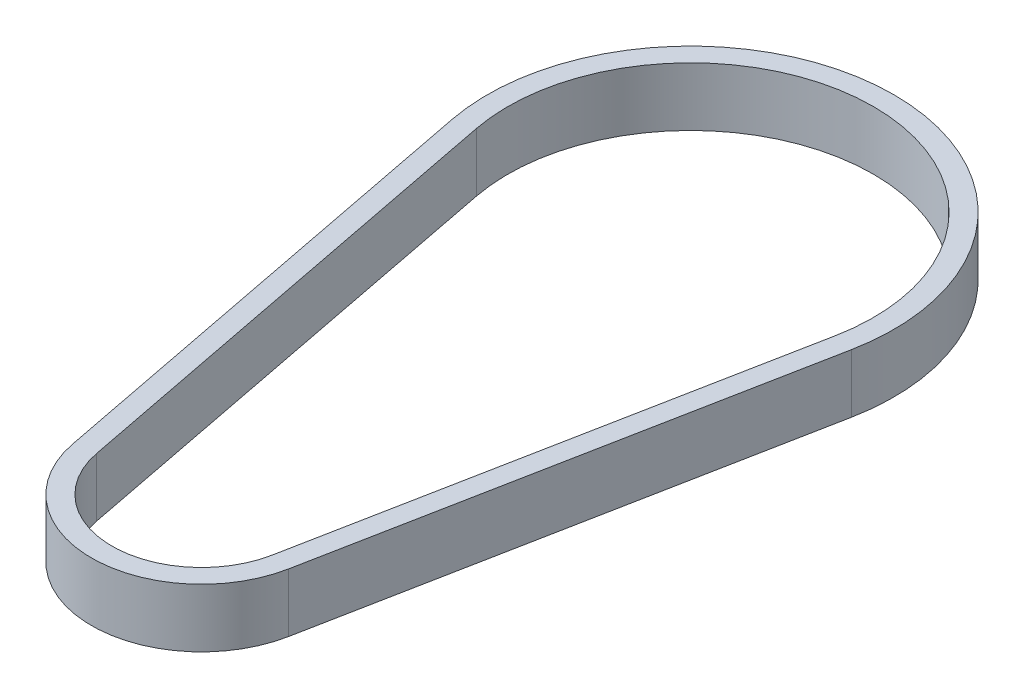
ISO-10303-21;
HEADER;
FILE_DESCRIPTION(('STEP AP214'),'2;1');
FILE_NAME('part.step','',(''),(''),'','','');
FILE_SCHEMA(('AUTOMOTIVE_DESIGN { 1 0 10303 214 1 1 1 1 }'));
ENDSEC;
DATA;
#1=APPLICATION_CONTEXT('core data for automotive mechanical design processes');
#2=APPLICATION_PROTOCOL_DEFINITION('international standard','automotive_design',2000,#1);
#3=PRODUCT_CONTEXT('',#1,'mechanical');
#4=PRODUCT('Part','Part','',(#3));
#5=PRODUCT_RELATED_PRODUCT_CATEGORY('part','',(#4));
#6=PRODUCT_DEFINITION_FORMATION('','',#4);
#7=PRODUCT_DEFINITION_CONTEXT('part definition',#1,'design');
#8=PRODUCT_DEFINITION('design','',#6,#7);
#9=PRODUCT_DEFINITION_SHAPE('','',#8);
#10=(LENGTH_UNIT() NAMED_UNIT(*) SI_UNIT(.MILLI.,.METRE.));
#11=(NAMED_UNIT(*) PLANE_ANGLE_UNIT() SI_UNIT($,.RADIAN.));
#12=(NAMED_UNIT(*) SI_UNIT($,.STERADIAN.) SOLID_ANGLE_UNIT());
#13=UNCERTAINTY_MEASURE_WITH_UNIT(LENGTH_MEASURE(1.E-05),#10,'distance_accuracy_value','');
#14=(GEOMETRIC_REPRESENTATION_CONTEXT(3) GLOBAL_UNCERTAINTY_ASSIGNED_CONTEXT((#13)) GLOBAL_UNIT_ASSIGNED_CONTEXT((#10,
#11,#12)) REPRESENTATION_CONTEXT('',''));
#15=CARTESIAN_POINT('',(0.,0.,0.));
#16=DIRECTION('',(0.,0.,1.));
#17=DIRECTION('',(1.,0.,0.));
#18=AXIS2_PLACEMENT_3D('',#15,#16,#17);
#19=CARTESIAN_POINT('',(11.823075737423,6.014,72.666481105304));
#20=DIRECTION('',(0.981657189929735,0.,-0.190654560551948));
#21=DIRECTION('',(-0.190654560551948,0.,-0.981657189929735));
#22=AXIS2_PLACEMENT_3D('',#19,#20,#21);
#23=PLANE('',#22);
#24=DIRECTION('',(0.,1.,0.));
#25=VECTOR('',#24,1.);
#26=CARTESIAN_POINT('',(2.44894008548253,6.014,24.4001945006169));
#27=LINE('',#26,#25);
#28=CARTESIAN_POINT('',(2.44894008548231,0.0140000000000099,24.4001945006172));
#29=VERTEX_POINT('',#28);
#30=CARTESIAN_POINT('',(2.44894008548231,6.014,24.4001945006172));
#31=VERTEX_POINT('',#30);
#32=EDGE_CURVE('E96',#29,#31,#27,.T.);
#33=ORIENTED_EDGE('',*,*,#32,.T.);
#34=DIRECTION('',(0.190654560552219,0.,0.981657189929682));
#35=VECTOR('',#34,1.);
#36=CARTESIAN_POINT('',(2.448940085482,6.014,24.400194500617));
#37=LINE('',#36,#35);
#38=CARTESIAN_POINT('',(11.8230757374227,6.014,72.6664811053043));
#39=VERTEX_POINT('',#38);
#40=EDGE_CURVE('E95',#31,#39,#37,.T.);
#41=ORIENTED_EDGE('',*,*,#40,.T.);
#42=DIRECTION('',(0.,1.,0.));
#43=VECTOR('',#42,1.);
#44=CARTESIAN_POINT('',(11.8230757374223,6.014,72.6664811053041));
#45=LINE('',#44,#43);
#46=CARTESIAN_POINT('',(11.8230757374227,0.0140000000000098,72.6664811053043));
#47=VERTEX_POINT('',#46);
#48=EDGE_CURVE('E121',#39,#47,#45,.F.);
#49=ORIENTED_EDGE('',*,*,#48,.T.);
#50=DIRECTION('',(0.190654560552219,0.,0.981657189929682));
#51=VECTOR('',#50,1.);
#52=CARTESIAN_POINT('',(2.448940085482,0.0140000000000083,24.400194500617));
#53=LINE('',#52,#51);
#54=EDGE_CURVE('E132',#29,#47,#53,.T.);
#55=ORIENTED_EDGE('',*,*,#54,.F.);
#56=EDGE_LOOP('',(#33,#41,#49,#55));
#57=FACE_BOUND('',#56,.T.);
#58=ADVANCED_FACE('F15',(#57),#23,.T.);
#59=CARTESIAN_POINT('',(20.8232,6.014,70.918503548781));
#60=DIRECTION('',(0.,1.,0.));
#61=DIRECTION('',(0.,0.,1.));
#62=AXIS2_PLACEMENT_3D('',#59,#60,#61);
#63=CYLINDRICAL_SURFACE('',#62,9.168296585514);
#64=CARTESIAN_POINT('',(20.8232,0.0140000000000097,70.918503548781));
#65=DIRECTION('',(0.,1.,0.));
#66=DIRECTION('',(0.,0.,1.));
#67=AXIS2_PLACEMENT_3D('',#64,#65,#66);
#68=CIRCLE('',#67,9.168296585514);
#69=CARTESIAN_POINT('',(29.8233242625836,0.0140000000000098,72.6664811053055));
#70=VERTEX_POINT('',#69);
#71=EDGE_CURVE('E129',#47,#70,#68,.T.);
#72=ORIENTED_EDGE('',*,*,#71,.F.);
#73=ORIENTED_EDGE('',*,*,#48,.F.);
#74=CARTESIAN_POINT('',(20.8232,6.014,70.918503548781));
#75=DIRECTION('',(0.,1.,0.));
#76=DIRECTION('',(0.,0.,1.));
#77=AXIS2_PLACEMENT_3D('',#74,#75,#76);
#78=CIRCLE('',#77,9.168296585514);
#79=CARTESIAN_POINT('',(29.8233242625836,6.014,72.6664811053055));
#80=VERTEX_POINT('',#79);
#81=EDGE_CURVE('E108',#39,#80,#78,.T.);
#82=ORIENTED_EDGE('',*,*,#81,.T.);
#83=DIRECTION('',(0.,1.,0.));
#84=VECTOR('',#83,1.);
#85=CARTESIAN_POINT('',(29.8233242625903,6.014,72.6664811053066));
#86=LINE('',#85,#84);
#87=EDGE_CURVE('E117',#70,#80,#86,.T.);
#88=ORIENTED_EDGE('',*,*,#87,.F.);
#89=EDGE_LOOP('',(#72,#73,#82,#88));
#90=FACE_BOUND('',#89,.T.);
#91=ADVANCED_FACE('F139',(#90),#63,.F.);
#92=CARTESIAN_POINT('',(39.197459914518,6.014,24.400194500617));
#93=DIRECTION('',(-0.981657189929735,0.,-0.190654560551948));
#94=DIRECTION('',(-0.190654560551948,0.,0.981657189929735));
#95=AXIS2_PLACEMENT_3D('',#92,#93,#94);
#96=PLANE('',#95);
#97=ORIENTED_EDGE('',*,*,#87,.T.);
#98=DIRECTION('',(0.190654560552219,0.,-0.981657189929682));
#99=VECTOR('',#98,1.);
#100=CARTESIAN_POINT('',(29.823324262577,6.014,72.666481105304));
#101=LINE('',#100,#99);
#102=CARTESIAN_POINT('',(39.1974599145177,6.014,24.4001945006172));
#103=VERTEX_POINT('',#102);
#104=EDGE_CURVE('E106',#80,#103,#101,.T.);
#105=ORIENTED_EDGE('',*,*,#104,.T.);
#106=DIRECTION('',(0.,1.,0.));
#107=VECTOR('',#106,1.);
#108=CARTESIAN_POINT('',(39.1974599145175,6.014,24.4001945006169));
#109=LINE('',#108,#107);
#110=CARTESIAN_POINT('',(39.1974599145177,0.0140000000000099,24.4001945006172));
#111=VERTEX_POINT('',#110);
#112=EDGE_CURVE('E115',#103,#111,#109,.F.);
#113=ORIENTED_EDGE('',*,*,#112,.T.);
#114=DIRECTION('',(0.190654560552219,0.,-0.981657189929682));
#115=VECTOR('',#114,1.);
#116=CARTESIAN_POINT('',(29.823324262577,0.0140000000000136,72.666481105304));
#117=LINE('',#116,#115);
#118=EDGE_CURVE('E128',#70,#111,#117,.T.);
#119=ORIENTED_EDGE('',*,*,#118,.F.);
#120=EDGE_LOOP('',(#97,#105,#113,#119));
#121=FACE_BOUND('',#120,.T.);
#122=ADVANCED_FACE('F145',(#121),#96,.T.);
#123=CARTESIAN_POINT('',(20.8232,6.014,20.8316));
#124=DIRECTION('',(0.,1.,0.));
#125=DIRECTION('',(0.,0.,1.));
#126=AXIS2_PLACEMENT_3D('',#123,#124,#125);
#127=CYLINDRICAL_SURFACE('',#126,18.717593171027);
#128=CARTESIAN_POINT('',(20.8232,0.0140000000000097,20.8316));
#129=DIRECTION('',(0.,1.,0.));
#130=DIRECTION('',(0.,0.,1.));
#131=AXIS2_PLACEMENT_3D('',#128,#129,#130);
#132=CIRCLE('',#131,18.717593171027);
#133=EDGE_CURVE('E114',#111,#29,#132,.T.);
#134=ORIENTED_EDGE('',*,*,#133,.F.);
#135=ORIENTED_EDGE('',*,*,#112,.F.);
#136=CARTESIAN_POINT('',(20.8232,6.014,20.8316));
#137=DIRECTION('',(0.,1.,0.));
#138=DIRECTION('',(0.,0.,1.));
#139=AXIS2_PLACEMENT_3D('',#136,#137,#138);
#140=CIRCLE('',#139,18.717593171027);
#141=EDGE_CURVE('E87',#103,#31,#140,.T.);
#142=ORIENTED_EDGE('',*,*,#141,.T.);
#143=ORIENTED_EDGE('',*,*,#32,.F.);
#144=EDGE_LOOP('',(#134,#135,#142,#143));
#145=FACE_BOUND('',#144,.T.);
#146=ADVANCED_FACE('F152',(#145),#127,.F.);
#147=CARTESIAN_POINT('',(20.8232,6.014,70.918503548781));
#148=DIRECTION('',(0.,1.,0.));
#149=DIRECTION('',(0.,0.,1.));
#150=AXIS2_PLACEMENT_3D('',#147,#148,#149);
#151=CYLINDRICAL_SURFACE('',#150,11.268296585514);
#152=CARTESIAN_POINT('',(20.8232,0.0140000000000097,70.918503548781));
#153=DIRECTION('',(0.,1.,0.));
#154=DIRECTION('',(0.,0.,1.));
#155=AXIS2_PLACEMENT_3D('',#152,#153,#154);
#156=CIRCLE('',#155,11.268296585514);
#157=CARTESIAN_POINT('',(31.8848043614362,0.0140000000000098,73.0668556824652));
#158=VERTEX_POINT('',#157);
#159=CARTESIAN_POINT('',(9.76159563856973,0.0140000000000098,73.0668556824626));
#160=VERTEX_POINT('',#159);
#161=EDGE_CURVE('E82',#158,#160,#156,.F.);
#162=ORIENTED_EDGE('',*,*,#161,.F.);
#163=DIRECTION('',(0.,1.,0.));
#164=VECTOR('',#163,1.);
#165=CARTESIAN_POINT('',(31.8848043614423,6.014,73.0668556824664));
#166=LINE('',#165,#164);
#167=CARTESIAN_POINT('',(31.8848043614426,6.014,73.066855682465));
#168=VERTEX_POINT('',#167);
#169=EDGE_CURVE('E78',#158,#168,#166,.T.);
#170=ORIENTED_EDGE('',*,*,#169,.T.);
#171=CARTESIAN_POINT('',(20.8232,6.014,70.918503548781));
#172=DIRECTION('',(0.,1.,0.));
#173=DIRECTION('',(0.,0.,1.));
#174=AXIS2_PLACEMENT_3D('',#171,#172,#173);
#175=CIRCLE('',#174,11.268296585514);
#176=CARTESIAN_POINT('',(9.76159563856973,6.014,73.0668556824626));
#177=VERTEX_POINT('',#176);
#178=EDGE_CURVE('E18',#168,#177,#175,.F.);
#179=ORIENTED_EDGE('',*,*,#178,.T.);
#180=DIRECTION('',(0.,1.,0.));
#181=VECTOR('',#180,1.);
#182=CARTESIAN_POINT('',(9.76159563857,6.014,73.066855682464));
#183=LINE('',#182,#181);
#184=EDGE_CURVE('E112',#177,#160,#183,.F.);
#185=ORIENTED_EDGE('',*,*,#184,.T.);
#186=EDGE_LOOP('',(#162,#170,#179,#185));
#187=FACE_BOUND('',#186,.T.);
#188=ADVANCED_FACE('F80',(#187),#151,.T.);
#189=CARTESIAN_POINT('',(20.8232,6.014,39.969502799669));
#190=DIRECTION('',(0.,-1.,0.));
#191=DIRECTION('',(0.,0.,-1.));
#192=AXIS2_PLACEMENT_3D('',#189,#190,#191);
#193=PLANE('',#192);
#194=ORIENTED_EDGE('',*,*,#104,.F.);
#195=ORIENTED_EDGE('',*,*,#81,.F.);
#196=ORIENTED_EDGE('',*,*,#40,.F.);
#197=ORIENTED_EDGE('',*,*,#141,.F.);
#198=EDGE_LOOP('',(#194,#195,#196,#197));
#199=FACE_BOUND('',#198,.T.);
#200=DIRECTION('',(-0.190654560551948,0.,-0.981657189929735));
#201=VECTOR('',#200,1.);
#202=CARTESIAN_POINT('',(9.76159563857,6.014,73.066855682464));
#203=LINE('',#202,#201);
#204=CARTESIAN_POINT('',(0.387459986635766,6.014,24.800569077773));
#205=VERTEX_POINT('',#204);
#206=EDGE_CURVE('E93',#205,#177,#203,.F.);
#207=ORIENTED_EDGE('',*,*,#206,.T.);
#208=ORIENTED_EDGE('',*,*,#178,.F.);
#209=DIRECTION('',(-0.190654560551948,0.,0.981657189929735));
#210=VECTOR('',#209,1.);
#211=CARTESIAN_POINT('',(41.25894001337,6.014,24.800569077777));
#212=LINE('',#211,#210);
#213=CARTESIAN_POINT('',(41.2589400133704,6.014,24.8005690777742));
#214=VERTEX_POINT('',#213);
#215=EDGE_CURVE('E86',#168,#214,#212,.F.);
#216=ORIENTED_EDGE('',*,*,#215,.T.);
#217=CARTESIAN_POINT('',(20.8232,6.014,20.8316));
#218=DIRECTION('',(0.,1.,0.));
#219=DIRECTION('',(0.,0.,1.));
#220=AXIS2_PLACEMENT_3D('',#217,#218,#219);
#221=CIRCLE('',#220,20.817593171027);
#222=EDGE_CURVE('E111',#205,#214,#221,.F.);
#223=ORIENTED_EDGE('',*,*,#222,.F.);
#224=EDGE_LOOP('',(#207,#208,#216,#223));
#225=FACE_BOUND('',#224,.T.);
#226=ADVANCED_FACE('F90',(#199,#225),#193,.F.);
#227=CARTESIAN_POINT('',(41.25894001337,6.014,24.800569077777));
#228=DIRECTION('',(-0.981657189929735,0.,-0.190654560551948));
#229=DIRECTION('',(-0.190654560551948,0.,0.981657189929735));
#230=AXIS2_PLACEMENT_3D('',#227,#228,#229);
#231=PLANE('',#230);
#232=ORIENTED_EDGE('',*,*,#169,.F.);
#233=DIRECTION('',(-0.190654560552199,0.,0.981657189929686));
#234=VECTOR('',#233,1.);
#235=CARTESIAN_POINT('',(41.25894001337,0.0140000000000083,24.800569077777));
#236=LINE('',#235,#234);
#237=CARTESIAN_POINT('',(41.2589400133699,0.0140000000000095,24.8005690777768));
#238=VERTEX_POINT('',#237);
#239=EDGE_CURVE('E101',#238,#158,#236,.T.);
#240=ORIENTED_EDGE('',*,*,#239,.F.);
#241=DIRECTION('',(0.,1.,0.));
#242=VECTOR('',#241,1.);
#243=CARTESIAN_POINT('',(41.2589400133697,6.014,24.8005690777769));
#244=LINE('',#243,#242);
#245=EDGE_CURVE('E99',#214,#238,#244,.F.);
#246=ORIENTED_EDGE('',*,*,#245,.F.);
#247=ORIENTED_EDGE('',*,*,#215,.F.);
#248=EDGE_LOOP('',(#232,#240,#246,#247));
#249=FACE_BOUND('',#248,.T.);
#250=ADVANCED_FACE('F97',(#249),#231,.F.);
#251=CARTESIAN_POINT('',(20.8232,0.01400000000001,39.969502799669));
#252=DIRECTION('',(0.,-1.,0.));
#253=DIRECTION('',(0.,0.,-1.));
#254=AXIS2_PLACEMENT_3D('',#251,#252,#253);
#255=PLANE('',#254);
#256=ORIENTED_EDGE('',*,*,#118,.T.);
#257=ORIENTED_EDGE('',*,*,#133,.T.);
#258=ORIENTED_EDGE('',*,*,#54,.T.);
#259=ORIENTED_EDGE('',*,*,#71,.T.);
#260=EDGE_LOOP('',(#256,#257,#258,#259));
#261=FACE_BOUND('',#260,.T.);
#262=DIRECTION('',(-0.190654560551948,0.,-0.981657189929735));
#263=VECTOR('',#262,1.);
#264=CARTESIAN_POINT('',(9.76159563857,0.0140000000000097,73.066855682464));
#265=LINE('',#264,#263);
#266=CARTESIAN_POINT('',(0.387459986635766,0.0140000000000095,24.800569077773));
#267=VERTEX_POINT('',#266);
#268=EDGE_CURVE('E33',#160,#267,#265,.T.);
#269=ORIENTED_EDGE('',*,*,#268,.T.);
#270=CARTESIAN_POINT('',(20.8232,0.0140000000000088,20.8316));
#271=DIRECTION('',(0.,1.,0.));
#272=DIRECTION('',(0.,0.,1.));
#273=AXIS2_PLACEMENT_3D('',#270,#271,#272);
#274=CIRCLE('',#273,20.817593171027);
#275=EDGE_CURVE('E24',#238,#267,#274,.T.);
#276=ORIENTED_EDGE('',*,*,#275,.F.);
#277=ORIENTED_EDGE('',*,*,#239,.T.);
#278=ORIENTED_EDGE('',*,*,#161,.T.);
#279=EDGE_LOOP('',(#269,#276,#277,#278));
#280=FACE_BOUND('',#279,.T.);
#281=ADVANCED_FACE('F155',(#261,#280),#255,.T.);
#282=CARTESIAN_POINT('',(9.76159563857,6.014,73.066855682464));
#283=DIRECTION('',(0.981657189929735,0.,-0.190654560551948));
#284=DIRECTION('',(-0.190654560551948,0.,-0.981657189929735));
#285=AXIS2_PLACEMENT_3D('',#282,#283,#284);
#286=PLANE('',#285);
#287=DIRECTION('',(0.,1.,0.));
#288=VECTOR('',#287,1.);
#289=CARTESIAN_POINT('',(0.387459986630274,6.014,24.8005690777769));
#290=LINE('',#289,#288);
#291=EDGE_CURVE('E9',#267,#205,#290,.T.);
#292=ORIENTED_EDGE('',*,*,#291,.F.);
#293=ORIENTED_EDGE('',*,*,#268,.F.);
#294=ORIENTED_EDGE('',*,*,#184,.F.);
#295=ORIENTED_EDGE('',*,*,#206,.F.);
#296=EDGE_LOOP('',(#292,#293,#294,#295));
#297=FACE_BOUND('',#296,.T.);
#298=ADVANCED_FACE('F162',(#297),#286,.F.);
#299=CARTESIAN_POINT('',(20.8232,6.014,20.8316));
#300=DIRECTION('',(0.,1.,0.));
#301=DIRECTION('',(0.,0.,1.));
#302=AXIS2_PLACEMENT_3D('',#299,#300,#301);
#303=CYLINDRICAL_SURFACE('',#302,20.817593171027);
#304=ORIENTED_EDGE('',*,*,#275,.T.);
#305=ORIENTED_EDGE('',*,*,#291,.T.);
#306=ORIENTED_EDGE('',*,*,#222,.T.);
#307=ORIENTED_EDGE('',*,*,#245,.T.);
#308=EDGE_LOOP('',(#304,#305,#306,#307));
#309=FACE_BOUND('',#308,.T.);
#310=ADVANCED_FACE('F160',(#309),#303,.T.);
#311=CLOSED_SHELL('',(#58,#91,#122,#146,#188,#226,#250,#281,#298,#310));
#312=MANIFOLD_SOLID_BREP('B1',#311);
#313=ADVANCED_BREP_SHAPE_REPRESENTATION('',(#18,#312),#14);
#314=SHAPE_DEFINITION_REPRESENTATION(#9,#313);
ENDSEC;
END-ISO-10303-21;
